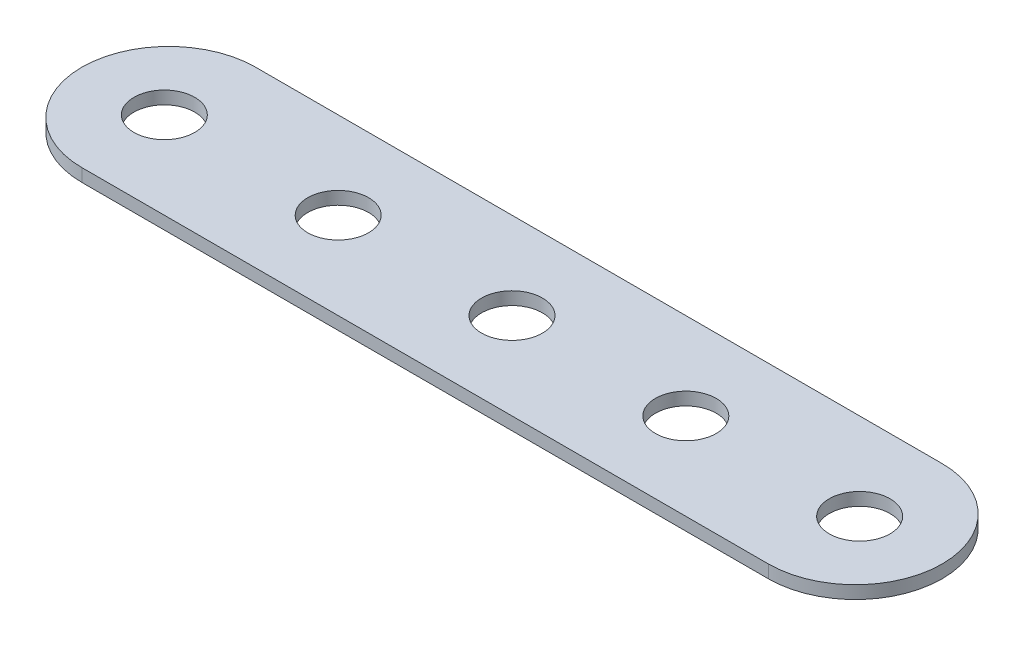
ISO-10303-21;
HEADER;
FILE_DESCRIPTION(('STEP AP214'),'2;1');
FILE_NAME('part.step','',(''),(''),'','','');
FILE_SCHEMA(('AUTOMOTIVE_DESIGN { 1 0 10303 214 1 1 1 1 }'));
ENDSEC;
DATA;
#1=APPLICATION_CONTEXT('core data for automotive mechanical design processes');
#2=APPLICATION_PROTOCOL_DEFINITION('international standard','automotive_design',2000,#1);
#3=PRODUCT_CONTEXT('',#1,'mechanical');
#4=PRODUCT('Part','Part','',(#3));
#5=PRODUCT_RELATED_PRODUCT_CATEGORY('part','',(#4));
#6=PRODUCT_DEFINITION_FORMATION('','',#4);
#7=PRODUCT_DEFINITION_CONTEXT('part definition',#1,'design');
#8=PRODUCT_DEFINITION('design','',#6,#7);
#9=PRODUCT_DEFINITION_SHAPE('','',#8);
#10=(LENGTH_UNIT() NAMED_UNIT(*) SI_UNIT(.MILLI.,.METRE.));
#11=(NAMED_UNIT(*) PLANE_ANGLE_UNIT() SI_UNIT($,.RADIAN.));
#12=(NAMED_UNIT(*) SI_UNIT($,.STERADIAN.) SOLID_ANGLE_UNIT());
#13=UNCERTAINTY_MEASURE_WITH_UNIT(LENGTH_MEASURE(1.E-05),#10,'distance_accuracy_value','');
#14=(GEOMETRIC_REPRESENTATION_CONTEXT(3) GLOBAL_UNCERTAINTY_ASSIGNED_CONTEXT((#13)) GLOBAL_UNIT_ASSIGNED_CONTEXT((#10,
#11,#12)) REPRESENTATION_CONTEXT('',''));
#15=CARTESIAN_POINT('',(0.,0.,0.));
#16=DIRECTION('',(0.,0.,1.));
#17=DIRECTION('',(1.,0.,0.));
#18=AXIS2_PLACEMENT_3D('',#15,#16,#17);
#19=CARTESIAN_POINT('',(0.,0.9398,6.35));
#20=DIRECTION('',(0.,0.,-1.));
#21=DIRECTION('',(-1.,0.,0.));
#22=AXIS2_PLACEMENT_3D('',#19,#20,#21);
#23=PLANE('',#22);
#24=DIRECTION('',(1.,0.,0.));
#25=VECTOR('',#24,1.);
#26=CARTESIAN_POINT('',(0.,0.,6.35));
#27=LINE('',#26,#25);
#28=CARTESIAN_POINT('',(-50.165,0.,6.35));
#29=VERTEX_POINT('',#28);
#30=CARTESIAN_POINT('',(0.,0.,6.35));
#31=VERTEX_POINT('',#30);
#32=EDGE_CURVE('E108',#29,#31,#27,.T.);
#33=ORIENTED_EDGE('',*,*,#32,.T.);
#34=DIRECTION('',(0.,-1.,0.));
#35=VECTOR('',#34,1.);
#36=CARTESIAN_POINT('',(0.,0.9398,6.35));
#37=LINE('',#36,#35);
#38=CARTESIAN_POINT('',(0.,0.9398,6.35));
#39=VERTEX_POINT('',#38);
#40=EDGE_CURVE('E92',#39,#31,#37,.T.);
#41=ORIENTED_EDGE('',*,*,#40,.F.);
#42=DIRECTION('',(1.,0.,0.));
#43=VECTOR('',#42,1.);
#44=CARTESIAN_POINT('',(0.,0.9398,6.35));
#45=LINE('',#44,#43);
#46=CARTESIAN_POINT('',(-50.165,0.9398,6.35));
#47=VERTEX_POINT('',#46);
#48=EDGE_CURVE('E86',#47,#39,#45,.T.);
#49=ORIENTED_EDGE('',*,*,#48,.F.);
#50=DIRECTION('',(0.,-1.,0.));
#51=VECTOR('',#50,1.);
#52=CARTESIAN_POINT('',(-50.165,0.9398,6.35));
#53=LINE('',#52,#51);
#54=EDGE_CURVE('E97',#47,#29,#53,.T.);
#55=ORIENTED_EDGE('',*,*,#54,.T.);
#56=EDGE_LOOP('',(#33,#41,#49,#55));
#57=FACE_BOUND('',#56,.T.);
#58=ADVANCED_FACE('F32',(#57),#23,.F.);
#59=CARTESIAN_POINT('',(0.,0.9398,0.));
#60=DIRECTION('',(0.,-1.,0.));
#61=DIRECTION('',(0.,0.,-1.));
#62=AXIS2_PLACEMENT_3D('',#59,#60,#61);
#63=CYLINDRICAL_SURFACE('',#62,6.35);
#64=CARTESIAN_POINT('',(0.,0.,0.));
#65=DIRECTION('',(0.,1.,0.));
#66=DIRECTION('',(0.,0.,1.));
#67=AXIS2_PLACEMENT_3D('',#64,#65,#66);
#68=CIRCLE('',#67,6.35);
#69=CARTESIAN_POINT('',(0.,0.,-6.35));
#70=VERTEX_POINT('',#69);
#71=EDGE_CURVE('E91',#31,#70,#68,.T.);
#72=ORIENTED_EDGE('',*,*,#71,.T.);
#73=DIRECTION('',(0.,-1.,0.));
#74=VECTOR('',#73,1.);
#75=CARTESIAN_POINT('',(0.,0.9398,-6.35));
#76=LINE('',#75,#74);
#77=CARTESIAN_POINT('',(0.,0.9398,-6.35));
#78=VERTEX_POINT('',#77);
#79=EDGE_CURVE('E89',#78,#70,#76,.T.);
#80=ORIENTED_EDGE('',*,*,#79,.F.);
#81=CARTESIAN_POINT('',(0.,0.9398,0.));
#82=DIRECTION('',(0.,1.,0.));
#83=DIRECTION('',(0.,0.,1.));
#84=AXIS2_PLACEMENT_3D('',#81,#82,#83);
#85=CIRCLE('',#84,6.35);
#86=EDGE_CURVE('E80',#39,#78,#85,.T.);
#87=ORIENTED_EDGE('',*,*,#86,.F.);
#88=ORIENTED_EDGE('',*,*,#40,.T.);
#89=EDGE_LOOP('',(#72,#80,#87,#88));
#90=FACE_BOUND('',#89,.T.);
#91=ADVANCED_FACE('F90',(#90),#63,.T.);
#92=CARTESIAN_POINT('',(0.,0.9398,-6.35));
#93=DIRECTION('',(0.,0.,1.));
#94=DIRECTION('',(1.,0.,0.));
#95=AXIS2_PLACEMENT_3D('',#92,#93,#94);
#96=PLANE('',#95);
#97=DIRECTION('',(-1.,0.,0.));
#98=VECTOR('',#97,1.);
#99=CARTESIAN_POINT('',(0.,0.,-6.35));
#100=LINE('',#99,#98);
#101=CARTESIAN_POINT('',(-50.165,0.,-6.35));
#102=VERTEX_POINT('',#101);
#103=EDGE_CURVE('E66',#70,#102,#100,.T.);
#104=ORIENTED_EDGE('',*,*,#103,.T.);
#105=DIRECTION('',(0.,-1.,0.));
#106=VECTOR('',#105,1.);
#107=CARTESIAN_POINT('',(-50.165,0.9398,-6.35));
#108=LINE('',#107,#106);
#109=CARTESIAN_POINT('',(-50.165,0.9398,-6.35));
#110=VERTEX_POINT('',#109);
#111=EDGE_CURVE('E93',#110,#102,#108,.T.);
#112=ORIENTED_EDGE('',*,*,#111,.F.);
#113=DIRECTION('',(-1.,0.,0.));
#114=VECTOR('',#113,1.);
#115=CARTESIAN_POINT('',(0.,0.9398,-6.35));
#116=LINE('',#115,#114);
#117=EDGE_CURVE('E84',#78,#110,#116,.T.);
#118=ORIENTED_EDGE('',*,*,#117,.F.);
#119=ORIENTED_EDGE('',*,*,#79,.T.);
#120=EDGE_LOOP('',(#104,#112,#118,#119));
#121=FACE_BOUND('',#120,.T.);
#122=ADVANCED_FACE('F95',(#121),#96,.F.);
#123=CARTESIAN_POINT('',(0.317500000000001,0.9398,0.));
#124=DIRECTION('',(0.,-1.,0.));
#125=DIRECTION('',(0.,0.,-1.));
#126=AXIS2_PLACEMENT_3D('',#123,#124,#125);
#127=CYLINDRICAL_SURFACE('',#126,2.2225);
#128=CARTESIAN_POINT('',(0.317500000000001,0.9398,0.));
#129=DIRECTION('',(0.,1.,0.));
#130=DIRECTION('',(0.,0.,1.));
#131=AXIS2_PLACEMENT_3D('',#128,#129,#130);
#132=CIRCLE('',#131,2.2225);
#133=CARTESIAN_POINT('',(0.317500000000001,0.9398,2.2225));
#134=VERTEX_POINT('',#133);
#135=EDGE_CURVE('E167',#134,#134,#132,.T.);
#136=ORIENTED_EDGE('',*,*,#135,.T.);
#137=EDGE_LOOP('',(#136));
#138=FACE_BOUND('',#137,.T.);
#139=CARTESIAN_POINT('',(0.317500000000001,0.,0.));
#140=DIRECTION('',(0.,1.,0.));
#141=DIRECTION('',(0.,0.,1.));
#142=AXIS2_PLACEMENT_3D('',#139,#140,#141);
#143=CIRCLE('',#142,2.2225);
#144=CARTESIAN_POINT('',(0.317500000000001,0.,2.2225));
#145=VERTEX_POINT('',#144);
#146=EDGE_CURVE('E104',#145,#145,#143,.T.);
#147=ORIENTED_EDGE('',*,*,#146,.F.);
#148=EDGE_LOOP('',(#147));
#149=FACE_BOUND('',#148,.T.);
#150=ADVANCED_FACE('F151',(#138,#149),#127,.F.);
#151=CARTESIAN_POINT('',(-50.4825,0.9398,0.));
#152=DIRECTION('',(0.,-1.,0.));
#153=DIRECTION('',(0.,0.,-1.));
#154=AXIS2_PLACEMENT_3D('',#151,#152,#153);
#155=CYLINDRICAL_SURFACE('',#154,2.2225);
#156=CARTESIAN_POINT('',(-50.4825,0.9398,0.));
#157=DIRECTION('',(0.,1.,0.));
#158=DIRECTION('',(0.,0.,1.));
#159=AXIS2_PLACEMENT_3D('',#156,#157,#158);
#160=CIRCLE('',#159,2.2225);
#161=CARTESIAN_POINT('',(-50.4825,0.9398,2.2225));
#162=VERTEX_POINT('',#161);
#163=EDGE_CURVE('E114',#162,#162,#160,.T.);
#164=ORIENTED_EDGE('',*,*,#163,.T.);
#165=EDGE_LOOP('',(#164));
#166=FACE_BOUND('',#165,.T.);
#167=CARTESIAN_POINT('',(-50.4825,0.,0.));
#168=DIRECTION('',(0.,1.,0.));
#169=DIRECTION('',(0.,0.,1.));
#170=AXIS2_PLACEMENT_3D('',#167,#168,#169);
#171=CIRCLE('',#170,2.2225);
#172=CARTESIAN_POINT('',(-50.4825,0.,2.2225));
#173=VERTEX_POINT('',#172);
#174=EDGE_CURVE('E101',#173,#173,#171,.T.);
#175=ORIENTED_EDGE('',*,*,#174,.F.);
#176=EDGE_LOOP('',(#175));
#177=FACE_BOUND('',#176,.T.);
#178=ADVANCED_FACE('F137',(#166,#177),#155,.F.);
#179=CARTESIAN_POINT('',(-50.165,0.9398,0.));
#180=DIRECTION('',(0.,-1.,0.));
#181=DIRECTION('',(0.,0.,-1.));
#182=AXIS2_PLACEMENT_3D('',#179,#180,#181);
#183=CYLINDRICAL_SURFACE('',#182,6.35);
#184=CARTESIAN_POINT('',(-50.165,0.,0.));
#185=DIRECTION('',(0.,1.,0.));
#186=DIRECTION('',(0.,0.,1.));
#187=AXIS2_PLACEMENT_3D('',#184,#185,#186);
#188=CIRCLE('',#187,6.35);
#189=EDGE_CURVE('E72',#102,#29,#188,.T.);
#190=ORIENTED_EDGE('',*,*,#189,.T.);
#191=ORIENTED_EDGE('',*,*,#54,.F.);
#192=CARTESIAN_POINT('',(-50.165,0.9398,0.));
#193=DIRECTION('',(0.,1.,0.));
#194=DIRECTION('',(0.,0.,1.));
#195=AXIS2_PLACEMENT_3D('',#192,#193,#194);
#196=CIRCLE('',#195,6.35);
#197=EDGE_CURVE('E49',#110,#47,#196,.T.);
#198=ORIENTED_EDGE('',*,*,#197,.F.);
#199=ORIENTED_EDGE('',*,*,#111,.T.);
#200=EDGE_LOOP('',(#190,#191,#198,#199));
#201=FACE_BOUND('',#200,.T.);
#202=ADVANCED_FACE('F127',(#201),#183,.T.);
#203=CARTESIAN_POINT('',(0.,0.9398,0.));
#204=DIRECTION('',(0.,1.,0.));
#205=DIRECTION('',(0.,0.,1.));
#206=AXIS2_PLACEMENT_3D('',#203,#204,#205);
#207=PLANE('',#206);
#208=CARTESIAN_POINT('',(-25.0825,0.9398,0.));
#209=DIRECTION('',(0.,1.,0.));
#210=DIRECTION('',(0.,0.,1.));
#211=AXIS2_PLACEMENT_3D('',#208,#209,#210);
#212=CIRCLE('',#211,2.2225);
#213=CARTESIAN_POINT('',(-25.0825,0.9398,2.2225));
#214=VERTEX_POINT('',#213);
#215=EDGE_CURVE('E175',#214,#214,#212,.T.);
#216=ORIENTED_EDGE('',*,*,#215,.F.);
#217=EDGE_LOOP('',(#216));
#218=FACE_BOUND('',#217,.T.);
#219=CARTESIAN_POINT('',(-37.7825,0.9398,0.));
#220=DIRECTION('',(0.,1.,0.));
#221=DIRECTION('',(0.,0.,1.));
#222=AXIS2_PLACEMENT_3D('',#219,#220,#221);
#223=CIRCLE('',#222,2.2225);
#224=CARTESIAN_POINT('',(-37.7825,0.9398,2.2225));
#225=VERTEX_POINT('',#224);
#226=EDGE_CURVE('E172',#225,#225,#223,.T.);
#227=ORIENTED_EDGE('',*,*,#226,.F.);
#228=EDGE_LOOP('',(#227));
#229=FACE_BOUND('',#228,.T.);
#230=ORIENTED_EDGE('',*,*,#163,.F.);
#231=EDGE_LOOP('',(#230));
#232=FACE_BOUND('',#231,.T.);
#233=ORIENTED_EDGE('',*,*,#135,.F.);
#234=EDGE_LOOP('',(#233));
#235=FACE_BOUND('',#234,.T.);
#236=ORIENTED_EDGE('',*,*,#48,.T.);
#237=ORIENTED_EDGE('',*,*,#86,.T.);
#238=ORIENTED_EDGE('',*,*,#117,.T.);
#239=ORIENTED_EDGE('',*,*,#197,.T.);
#240=EDGE_LOOP('',(#236,#237,#238,#239));
#241=FACE_BOUND('',#240,.T.);
#242=CARTESIAN_POINT('',(-12.3825,0.9398,0.));
#243=DIRECTION('',(0.,1.,0.));
#244=DIRECTION('',(0.,0.,1.));
#245=AXIS2_PLACEMENT_3D('',#242,#243,#244);
#246=CIRCLE('',#245,2.2225);
#247=CARTESIAN_POINT('',(-12.3825,0.9398,2.2225));
#248=VERTEX_POINT('',#247);
#249=EDGE_CURVE('E11',#248,#248,#246,.T.);
#250=ORIENTED_EDGE('',*,*,#249,.F.);
#251=EDGE_LOOP('',(#250));
#252=FACE_BOUND('',#251,.T.);
#253=ADVANCED_FACE('F81',(#218,#229,#232,#235,#241,#252),#207,.T.);
#254=CARTESIAN_POINT('',(0.,0.,0.));
#255=DIRECTION('',(0.,1.,0.));
#256=DIRECTION('',(0.,0.,1.));
#257=AXIS2_PLACEMENT_3D('',#254,#255,#256);
#258=PLANE('',#257);
#259=CARTESIAN_POINT('',(-25.0825,0.,0.));
#260=DIRECTION('',(0.,1.,0.));
#261=DIRECTION('',(0.,0.,1.));
#262=AXIS2_PLACEMENT_3D('',#259,#260,#261);
#263=CIRCLE('',#262,2.2225);
#264=CARTESIAN_POINT('',(-25.0825,0.,2.2225));
#265=VERTEX_POINT('',#264);
#266=EDGE_CURVE('E180',#265,#265,#263,.T.);
#267=ORIENTED_EDGE('',*,*,#266,.T.);
#268=EDGE_LOOP('',(#267));
#269=FACE_BOUND('',#268,.T.);
#270=CARTESIAN_POINT('',(-37.7825,0.,0.));
#271=DIRECTION('',(0.,1.,0.));
#272=DIRECTION('',(0.,0.,1.));
#273=AXIS2_PLACEMENT_3D('',#270,#271,#272);
#274=CIRCLE('',#273,2.2225);
#275=CARTESIAN_POINT('',(-37.7825,0.,2.2225));
#276=VERTEX_POINT('',#275);
#277=EDGE_CURVE('E105',#276,#276,#274,.T.);
#278=ORIENTED_EDGE('',*,*,#277,.T.);
#279=EDGE_LOOP('',(#278));
#280=FACE_BOUND('',#279,.T.);
#281=ORIENTED_EDGE('',*,*,#174,.T.);
#282=EDGE_LOOP('',(#281));
#283=FACE_BOUND('',#282,.T.);
#284=ORIENTED_EDGE('',*,*,#146,.T.);
#285=EDGE_LOOP('',(#284));
#286=FACE_BOUND('',#285,.T.);
#287=ORIENTED_EDGE('',*,*,#32,.F.);
#288=ORIENTED_EDGE('',*,*,#189,.F.);
#289=ORIENTED_EDGE('',*,*,#103,.F.);
#290=ORIENTED_EDGE('',*,*,#71,.F.);
#291=EDGE_LOOP('',(#287,#288,#289,#290));
#292=FACE_BOUND('',#291,.T.);
#293=CARTESIAN_POINT('',(-12.3825,0.,0.));
#294=DIRECTION('',(0.,1.,0.));
#295=DIRECTION('',(0.,0.,1.));
#296=AXIS2_PLACEMENT_3D('',#293,#294,#295);
#297=CIRCLE('',#296,2.2225);
#298=CARTESIAN_POINT('',(-12.3825,0.,2.2225));
#299=VERTEX_POINT('',#298);
#300=EDGE_CURVE('E41',#299,#299,#297,.T.);
#301=ORIENTED_EDGE('',*,*,#300,.T.);
#302=EDGE_LOOP('',(#301));
#303=FACE_BOUND('',#302,.T.);
#304=ADVANCED_FACE('F120',(#269,#280,#283,#286,#292,#303),#258,.F.);
#305=CARTESIAN_POINT('',(-37.7825,0.,0.));
#306=DIRECTION('',(0.,1.,0.));
#307=DIRECTION('',(0.,0.,1.));
#308=AXIS2_PLACEMENT_3D('',#305,#306,#307);
#309=CYLINDRICAL_SURFACE('',#308,2.2225);
#310=ORIENTED_EDGE('',*,*,#277,.F.);
#311=EDGE_LOOP('',(#310));
#312=FACE_BOUND('',#311,.T.);
#313=ORIENTED_EDGE('',*,*,#226,.T.);
#314=EDGE_LOOP('',(#313));
#315=FACE_BOUND('',#314,.T.);
#316=ADVANCED_FACE('F134',(#312,#315),#309,.F.);
#317=CARTESIAN_POINT('',(-25.0825,0.,0.));
#318=DIRECTION('',(0.,1.,0.));
#319=DIRECTION('',(0.,0.,1.));
#320=AXIS2_PLACEMENT_3D('',#317,#318,#319);
#321=CYLINDRICAL_SURFACE('',#320,2.2225);
#322=ORIENTED_EDGE('',*,*,#266,.F.);
#323=EDGE_LOOP('',(#322));
#324=FACE_BOUND('',#323,.T.);
#325=ORIENTED_EDGE('',*,*,#215,.T.);
#326=EDGE_LOOP('',(#325));
#327=FACE_BOUND('',#326,.T.);
#328=ADVANCED_FACE('F124',(#324,#327),#321,.F.);
#329=CARTESIAN_POINT('',(-12.3825,0.,0.));
#330=DIRECTION('',(0.,1.,0.));
#331=DIRECTION('',(0.,0.,1.));
#332=AXIS2_PLACEMENT_3D('',#329,#330,#331);
#333=CYLINDRICAL_SURFACE('',#332,2.2225);
#334=ORIENTED_EDGE('',*,*,#300,.F.);
#335=EDGE_LOOP('',(#334));
#336=FACE_BOUND('',#335,.T.);
#337=ORIENTED_EDGE('',*,*,#249,.T.);
#338=EDGE_LOOP('',(#337));
#339=FACE_BOUND('',#338,.T.);
#340=ADVANCED_FACE('F34',(#336,#339),#333,.F.);
#341=CLOSED_SHELL('',(#58,#91,#122,#150,#178,#202,#253,#304,#316,#328,#340));
#342=MANIFOLD_SOLID_BREP('B2',#341);
#343=ADVANCED_BREP_SHAPE_REPRESENTATION('',(#18,#342),#14);
#344=SHAPE_DEFINITION_REPRESENTATION(#9,#343);
ENDSEC;
END-ISO-10303-21;
